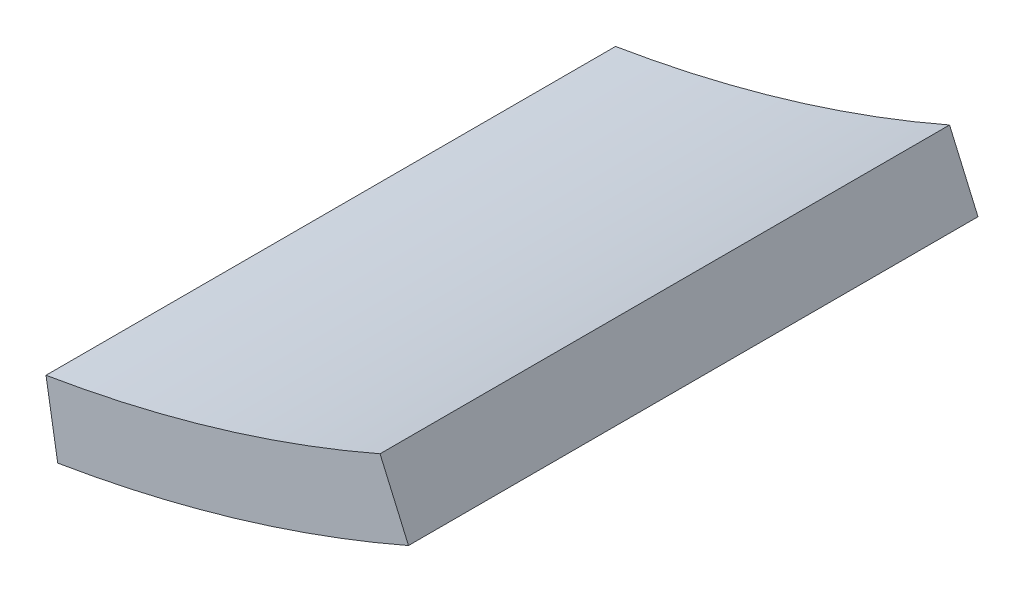
ISO-10303-21;
HEADER;
FILE_DESCRIPTION(('STEP AP214'),'2;1');
FILE_NAME('part.step','',(''),(''),'','','');
FILE_SCHEMA(('AUTOMOTIVE_DESIGN { 1 0 10303 214 1 1 1 1 }'));
ENDSEC;
DATA;
#1=APPLICATION_CONTEXT('core data for automotive mechanical design processes');
#2=APPLICATION_PROTOCOL_DEFINITION('international standard','automotive_design',2000,#1);
#3=PRODUCT_CONTEXT('',#1,'mechanical');
#4=PRODUCT('Part','Part','',(#3));
#5=PRODUCT_RELATED_PRODUCT_CATEGORY('part','',(#4));
#6=PRODUCT_DEFINITION_FORMATION('','',#4);
#7=PRODUCT_DEFINITION_CONTEXT('part definition',#1,'design');
#8=PRODUCT_DEFINITION('design','',#6,#7);
#9=PRODUCT_DEFINITION_SHAPE('','',#8);
#10=(LENGTH_UNIT() NAMED_UNIT(*) SI_UNIT(.MILLI.,.METRE.));
#11=(NAMED_UNIT(*) PLANE_ANGLE_UNIT() SI_UNIT($,.RADIAN.));
#12=(NAMED_UNIT(*) SI_UNIT($,.STERADIAN.) SOLID_ANGLE_UNIT());
#13=UNCERTAINTY_MEASURE_WITH_UNIT(LENGTH_MEASURE(1.E-05),#10,'distance_accuracy_value','');
#14=(GEOMETRIC_REPRESENTATION_CONTEXT(3) GLOBAL_UNCERTAINTY_ASSIGNED_CONTEXT((#13)) GLOBAL_UNIT_ASSIGNED_CONTEXT((#10,
#11,#12)) REPRESENTATION_CONTEXT('',''));
#15=CARTESIAN_POINT('',(0.,0.,0.));
#16=DIRECTION('',(0.,0.,1.));
#17=DIRECTION('',(1.,0.,0.));
#18=AXIS2_PLACEMENT_3D('',#15,#16,#17);
#19=CARTESIAN_POINT('',(-56.7436707041498,-28.5301444366949,10.));
#20=DIRECTION('',(-0.916652966330751,-0.39968404936529,0.));
#21=DIRECTION('',(-0.39968404936529,0.916652966330751,0.));
#22=AXIS2_PLACEMENT_3D('',#19,#20,#21);
#23=PLANE('',#22);
#24=DIRECTION('',(-0.39968404936529,0.916652966330751,0.));
#25=VECTOR('',#24,1.);
#26=CARTESIAN_POINT('',(-56.7436707041498,-28.5301444366949,-18.));
#27=LINE('',#26,#25);
#28=CARTESIAN_POINT('',(-36.3028837676258,-75.4099436412282,-18.));
#29=VERTEX_POINT('',#28);
#30=CARTESIAN_POINT('',(-38.0015409774042,-71.5141685343779,-18.));
#31=VERTEX_POINT('',#30);
#32=EDGE_CURVE('E11',#29,#31,#27,.T.);
#33=ORIENTED_EDGE('',*,*,#32,.T.);
#34=DIRECTION('',(0.,0.,-1.));
#35=VECTOR('',#34,1.);
#36=CARTESIAN_POINT('',(-38.0015409774042,-71.5141685343779,10.));
#37=LINE('',#36,#35);
#38=CARTESIAN_POINT('',(-38.0015409774042,-71.5141685343779,16.));
#39=VERTEX_POINT('',#38);
#40=EDGE_CURVE('E36',#39,#31,#37,.T.);
#41=ORIENTED_EDGE('',*,*,#40,.F.);
#42=DIRECTION('',(-0.39968404936529,0.916652966330751,0.));
#43=VECTOR('',#42,1.);
#44=CARTESIAN_POINT('',(-56.7436707041498,-28.5301444366949,16.));
#45=LINE('',#44,#43);
#46=CARTESIAN_POINT('',(-36.3028837676258,-75.4099436412282,16.));
#47=VERTEX_POINT('',#46);
#48=EDGE_CURVE('E76',#47,#39,#45,.T.);
#49=ORIENTED_EDGE('',*,*,#48,.F.);
#50=DIRECTION('',(0.,0.,-1.));
#51=VECTOR('',#50,1.);
#52=CARTESIAN_POINT('',(-36.3028837676258,-75.4099436412283,10.));
#53=LINE('',#52,#51);
#54=EDGE_CURVE('E27',#47,#29,#53,.T.);
#55=ORIENTED_EDGE('',*,*,#54,.T.);
#56=EDGE_LOOP('',(#33,#41,#49,#55));
#57=FACE_BOUND('',#56,.T.);
#58=ADVANCED_FACE('F17',(#57),#23,.F.);
#59=CARTESIAN_POINT('',(-71.8747641621128,6.17217036174182,10.));
#60=DIRECTION('',(0.,0.,-1.));
#61=DIRECTION('',(-1.,0.,0.));
#62=AXIS2_PLACEMENT_3D('',#59,#60,#61);
#63=CYLINDRICAL_SURFACE('',#62,88.9999999999623);
#64=CARTESIAN_POINT('',(-71.8747641621128,6.17217036174182,-18.));
#65=DIRECTION('',(0.,0.,1.));
#66=DIRECTION('',(-1.,0.,0.));
#67=AXIS2_PLACEMENT_3D('',#64,#65,#66);
#68=CIRCLE('',#67,88.9999999999623);
#69=CARTESIAN_POINT('',(-57.245400424119,-81.6172465210167,-18.));
#70=VERTEX_POINT('',#69);
#71=EDGE_CURVE('E88',#70,#29,#68,.T.);
#72=ORIENTED_EDGE('',*,*,#71,.T.);
#73=ORIENTED_EDGE('',*,*,#54,.F.);
#74=CARTESIAN_POINT('',(-71.8747641621128,6.17217036174182,16.));
#75=DIRECTION('',(0.,0.,1.));
#76=DIRECTION('',(-1.,0.,0.));
#77=AXIS2_PLACEMENT_3D('',#74,#75,#76);
#78=CIRCLE('',#77,88.9999999999623);
#79=CARTESIAN_POINT('',(-57.245400424119,-81.6172465210167,16.));
#80=VERTEX_POINT('',#79);
#81=EDGE_CURVE('E66',#80,#47,#78,.T.);
#82=ORIENTED_EDGE('',*,*,#81,.F.);
#83=DIRECTION('',(0.,0.,-1.));
#84=VECTOR('',#83,1.);
#85=CARTESIAN_POINT('',(-57.245400424119,-81.6172465210167,10.));
#86=LINE('',#85,#84);
#87=EDGE_CURVE('E61',#80,#70,#86,.T.);
#88=ORIENTED_EDGE('',*,*,#87,.T.);
#89=EDGE_LOOP('',(#72,#73,#82,#88));
#90=FACE_BOUND('',#89,.T.);
#91=ADVANCED_FACE('F110',(#90),#63,.T.);
#92=CARTESIAN_POINT('',(-66.0537894548532,-28.7589438268374,10.));
#93=DIRECTION('',(0.986397942503373,0.164374873460368,0.));
#94=DIRECTION('',(0.,0.,-1.));
#95=AXIS2_PLACEMENT_3D('',#92,#93,#94);
#96=PLANE('',#95);
#97=DIRECTION('',(0.164374873460368,-0.986397942503373,0.));
#98=VECTOR('',#97,1.);
#99=CARTESIAN_POINT('',(-66.0537894548532,-28.7589438268374,-18.));
#100=LINE('',#99,#98);
#101=CARTESIAN_POINT('',(-57.9439936363157,-77.4250552654369,-18.));
#102=VERTEX_POINT('',#101);
#103=EDGE_CURVE('E72',#102,#70,#100,.T.);
#104=ORIENTED_EDGE('',*,*,#103,.T.);
#105=ORIENTED_EDGE('',*,*,#87,.F.);
#106=DIRECTION('',(0.164374873460368,-0.986397942503373,0.));
#107=VECTOR('',#106,1.);
#108=CARTESIAN_POINT('',(-66.0537894548532,-28.7589438268374,16.));
#109=LINE('',#108,#107);
#110=CARTESIAN_POINT('',(-57.9439936363157,-77.4250552654369,16.));
#111=VERTEX_POINT('',#110);
#112=EDGE_CURVE('E59',#111,#80,#109,.T.);
#113=ORIENTED_EDGE('',*,*,#112,.F.);
#114=DIRECTION('',(0.,0.,-1.));
#115=VECTOR('',#114,1.);
#116=CARTESIAN_POINT('',(-57.9439936363157,-77.4250552654369,10.));
#117=LINE('',#116,#115);
#118=EDGE_CURVE('E55',#111,#102,#117,.T.);
#119=ORIENTED_EDGE('',*,*,#118,.T.);
#120=EDGE_LOOP('',(#104,#105,#113,#119));
#121=FACE_BOUND('',#120,.T.);
#122=ADVANCED_FACE('F60',(#121),#96,.F.);
#123=CARTESIAN_POINT('',(-71.8747641621128,6.17217036174182,10.));
#124=DIRECTION('',(0.,0.,-1.));
#125=DIRECTION('',(-1.,0.,0.));
#126=AXIS2_PLACEMENT_3D('',#123,#124,#125);
#127=CYLINDRICAL_SURFACE('',#126,84.7500000000227);
#128=CARTESIAN_POINT('',(-71.8747641621128,6.17217036174182,-18.));
#129=DIRECTION('',(0.,0.,1.));
#130=DIRECTION('',(-1.,0.,0.));
#131=AXIS2_PLACEMENT_3D('',#128,#129,#130);
#132=CIRCLE('',#131,84.7500000000227);
#133=EDGE_CURVE('E20',#102,#31,#132,.T.);
#134=ORIENTED_EDGE('',*,*,#133,.F.);
#135=ORIENTED_EDGE('',*,*,#118,.F.);
#136=CARTESIAN_POINT('',(-71.8747641621128,6.17217036174182,16.));
#137=DIRECTION('',(0.,0.,1.));
#138=DIRECTION('',(-1.,0.,0.));
#139=AXIS2_PLACEMENT_3D('',#136,#137,#138);
#140=CIRCLE('',#139,84.7500000000227);
#141=EDGE_CURVE('E69',#111,#39,#140,.T.);
#142=ORIENTED_EDGE('',*,*,#141,.T.);
#143=ORIENTED_EDGE('',*,*,#40,.T.);
#144=EDGE_LOOP('',(#134,#135,#142,#143));
#145=FACE_BOUND('',#144,.T.);
#146=ADVANCED_FACE('F68',(#145),#127,.F.);
#147=CARTESIAN_POINT('',(-51.833752333337,-26.38929492376,-18.));
#148=DIRECTION('',(0.,0.,1.));
#149=DIRECTION('',(1.,0.,0.));
#150=AXIS2_PLACEMENT_3D('',#147,#148,#149);
#151=PLANE('',#150);
#152=ORIENTED_EDGE('',*,*,#133,.T.);
#153=ORIENTED_EDGE('',*,*,#32,.F.);
#154=ORIENTED_EDGE('',*,*,#71,.F.);
#155=ORIENTED_EDGE('',*,*,#103,.F.);
#156=EDGE_LOOP('',(#152,#153,#154,#155));
#157=FACE_BOUND('',#156,.T.);
#158=ADVANCED_FACE('F106',(#157),#151,.F.);
#159=CARTESIAN_POINT('',(-51.833752333337,-26.38929492376,16.));
#160=DIRECTION('',(0.,0.,1.));
#161=DIRECTION('',(1.,0.,0.));
#162=AXIS2_PLACEMENT_3D('',#159,#160,#161);
#163=PLANE('',#162);
#164=ORIENTED_EDGE('',*,*,#141,.F.);
#165=ORIENTED_EDGE('',*,*,#112,.T.);
#166=ORIENTED_EDGE('',*,*,#81,.T.);
#167=ORIENTED_EDGE('',*,*,#48,.T.);
#168=EDGE_LOOP('',(#164,#165,#166,#167));
#169=FACE_BOUND('',#168,.T.);
#170=ADVANCED_FACE('F74',(#169),#163,.T.);
#171=CLOSED_SHELL('',(#58,#91,#122,#146,#158,#170));
#172=MANIFOLD_SOLID_BREP('B1',#171);
#173=ADVANCED_BREP_SHAPE_REPRESENTATION('',(#18,#172),#14);
#174=SHAPE_DEFINITION_REPRESENTATION(#9,#173);
ENDSEC;
END-ISO-10303-21;
